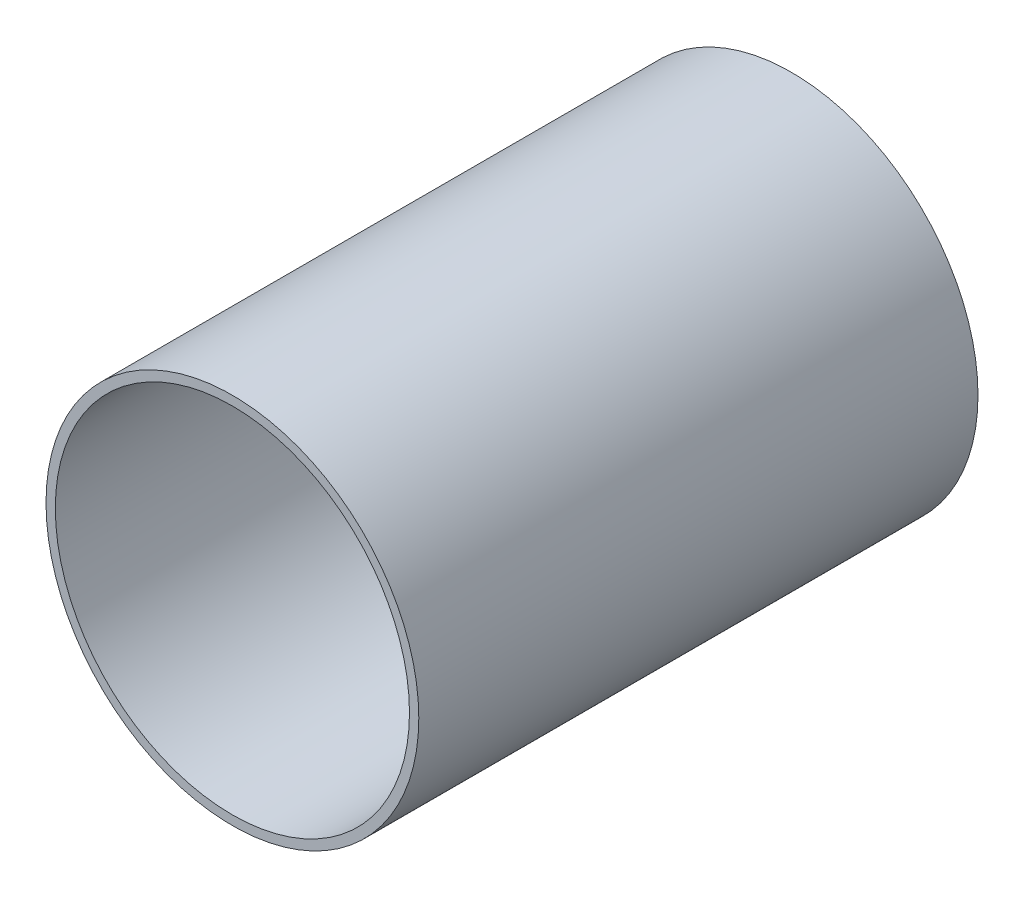
ISO-10303-21;
HEADER;
FILE_DESCRIPTION(('STEP AP214'),'2;1');
FILE_NAME('part.step','',(''),(''),'','','');
FILE_SCHEMA(('AUTOMOTIVE_DESIGN { 1 0 10303 214 1 1 1 1 }'));
ENDSEC;
DATA;
#1=APPLICATION_CONTEXT('core data for automotive mechanical design processes');
#2=APPLICATION_PROTOCOL_DEFINITION('international standard','automotive_design',2000,#1);
#3=PRODUCT_CONTEXT('',#1,'mechanical');
#4=PRODUCT('Part','Part','',(#3));
#5=PRODUCT_RELATED_PRODUCT_CATEGORY('part','',(#4));
#6=PRODUCT_DEFINITION_FORMATION('','',#4);
#7=PRODUCT_DEFINITION_CONTEXT('part definition',#1,'design');
#8=PRODUCT_DEFINITION('design','',#6,#7);
#9=PRODUCT_DEFINITION_SHAPE('','',#8);
#10=(LENGTH_UNIT() NAMED_UNIT(*) SI_UNIT(.MILLI.,.METRE.));
#11=(NAMED_UNIT(*) PLANE_ANGLE_UNIT() SI_UNIT($,.RADIAN.));
#12=(NAMED_UNIT(*) SI_UNIT($,.STERADIAN.) SOLID_ANGLE_UNIT());
#13=UNCERTAINTY_MEASURE_WITH_UNIT(LENGTH_MEASURE(1.E-05),#10,'distance_accuracy_value','');
#14=(GEOMETRIC_REPRESENTATION_CONTEXT(3) GLOBAL_UNCERTAINTY_ASSIGNED_CONTEXT((#13)) GLOBAL_UNIT_ASSIGNED_CONTEXT((#10,
#11,#12)) REPRESENTATION_CONTEXT('',''));
#15=CARTESIAN_POINT('',(0.,0.,0.));
#16=DIRECTION('',(0.,0.,1.));
#17=DIRECTION('',(1.,0.,0.));
#18=AXIS2_PLACEMENT_3D('',#15,#16,#17);
#19=CARTESIAN_POINT('',(0.,11.6608342465853,300.));
#20=DIRECTION('',(0.,0.,1.));
#21=DIRECTION('',(1.,0.,0.));
#22=AXIS2_PLACEMENT_3D('',#19,#20,#21);
#23=PLANE('',#22);
#24=CARTESIAN_POINT('',(0.,11.6608342465853,300.));
#25=DIRECTION('',(0.,0.,1.));
#26=DIRECTION('',(1.,0.,0.));
#27=AXIS2_PLACEMENT_3D('',#24,#25,#26);
#28=CIRCLE('',#27,100.);
#29=CARTESIAN_POINT('',(100.,11.6608342465853,300.));
#30=VERTEX_POINT('',#29);
#31=EDGE_CURVE('E10',#30,#30,#28,.T.);
#32=ORIENTED_EDGE('',*,*,#31,.T.);
#33=EDGE_LOOP('',(#32));
#34=FACE_BOUND('',#33,.T.);
#35=CARTESIAN_POINT('',(0.,11.6608342465853,300.));
#36=DIRECTION('',(0.,0.,1.));
#37=DIRECTION('',(1.,0.,0.));
#38=AXIS2_PLACEMENT_3D('',#35,#36,#37);
#39=CIRCLE('',#38,95.);
#40=CARTESIAN_POINT('',(95.,11.6608342465853,300.));
#41=VERTEX_POINT('',#40);
#42=EDGE_CURVE('E42',#41,#41,#39,.T.);
#43=ORIENTED_EDGE('',*,*,#42,.F.);
#44=EDGE_LOOP('',(#43));
#45=FACE_BOUND('',#44,.T.);
#46=ADVANCED_FACE('F31',(#34,#45),#23,.T.);
#47=CARTESIAN_POINT('',(0.,11.6608342465853,0.));
#48=DIRECTION('',(0.,0.,1.));
#49=DIRECTION('',(1.,0.,0.));
#50=AXIS2_PLACEMENT_3D('',#47,#48,#49);
#51=PLANE('',#50);
#52=CARTESIAN_POINT('',(0.,11.6608342465853,0.));
#53=DIRECTION('',(0.,0.,1.));
#54=DIRECTION('',(1.,0.,0.));
#55=AXIS2_PLACEMENT_3D('',#52,#53,#54);
#56=CIRCLE('',#55,100.);
#57=CARTESIAN_POINT('',(100.,11.6608342465853,0.));
#58=VERTEX_POINT('',#57);
#59=EDGE_CURVE('E35',#58,#58,#56,.T.);
#60=ORIENTED_EDGE('',*,*,#59,.F.);
#61=EDGE_LOOP('',(#60));
#62=FACE_BOUND('',#61,.T.);
#63=CARTESIAN_POINT('',(0.,11.6608342465853,0.));
#64=DIRECTION('',(0.,0.,1.));
#65=DIRECTION('',(1.,0.,0.));
#66=AXIS2_PLACEMENT_3D('',#63,#64,#65);
#67=CIRCLE('',#66,95.);
#68=CARTESIAN_POINT('',(95.,11.6608342465853,0.));
#69=VERTEX_POINT('',#68);
#70=EDGE_CURVE('E44',#69,#69,#67,.T.);
#71=ORIENTED_EDGE('',*,*,#70,.T.);
#72=EDGE_LOOP('',(#71));
#73=FACE_BOUND('',#72,.T.);
#74=ADVANCED_FACE('F54',(#62,#73),#51,.F.);
#75=CARTESIAN_POINT('',(0.,11.6608342465853,300.));
#76=DIRECTION('',(0.,0.,-1.));
#77=DIRECTION('',(-1.,0.,0.));
#78=AXIS2_PLACEMENT_3D('',#75,#76,#77);
#79=CYLINDRICAL_SURFACE('',#78,100.);
#80=ORIENTED_EDGE('',*,*,#31,.F.);
#81=EDGE_LOOP('',(#80));
#82=FACE_BOUND('',#81,.T.);
#83=ORIENTED_EDGE('',*,*,#59,.T.);
#84=EDGE_LOOP('',(#83));
#85=FACE_BOUND('',#84,.T.);
#86=ADVANCED_FACE('F33',(#82,#85),#79,.T.);
#87=CARTESIAN_POINT('',(0.,11.6608342465853,300.));
#88=DIRECTION('',(0.,0.,-1.));
#89=DIRECTION('',(-1.,0.,0.));
#90=AXIS2_PLACEMENT_3D('',#87,#88,#89);
#91=CYLINDRICAL_SURFACE('',#90,95.);
#92=ORIENTED_EDGE('',*,*,#42,.T.);
#93=EDGE_LOOP('',(#92));
#94=FACE_BOUND('',#93,.T.);
#95=ORIENTED_EDGE('',*,*,#70,.F.);
#96=EDGE_LOOP('',(#95));
#97=FACE_BOUND('',#96,.T.);
#98=ADVANCED_FACE('F50',(#94,#97),#91,.F.);
#99=CLOSED_SHELL('',(#46,#74,#86,#98));
#100=MANIFOLD_SOLID_BREP('B2',#99);
#101=ADVANCED_BREP_SHAPE_REPRESENTATION('',(#18,#100),#14);
#102=SHAPE_DEFINITION_REPRESENTATION(#9,#101);
ENDSEC;
END-ISO-10303-21;
